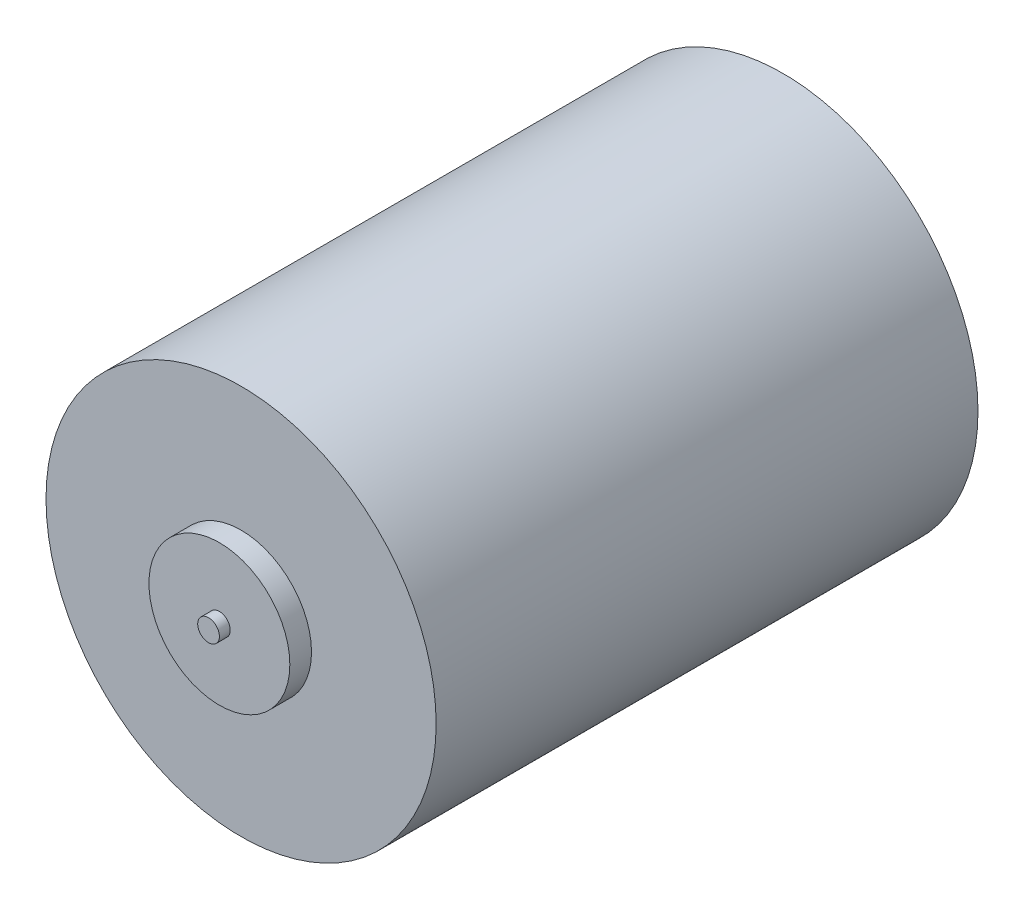
ISO-10303-21;
HEADER;
FILE_DESCRIPTION(('STEP AP214'),'2;1');
FILE_NAME('part.step','',(''),(''),'','','');
FILE_SCHEMA(('AUTOMOTIVE_DESIGN { 1 0 10303 214 1 1 1 1 }'));
ENDSEC;
DATA;
#1=APPLICATION_CONTEXT('core data for automotive mechanical design processes');
#2=APPLICATION_PROTOCOL_DEFINITION('international standard','automotive_design',2000,#1);
#3=PRODUCT_CONTEXT('',#1,'mechanical');
#4=PRODUCT('Part','Part','',(#3));
#5=PRODUCT_RELATED_PRODUCT_CATEGORY('part','',(#4));
#6=PRODUCT_DEFINITION_FORMATION('','',#4);
#7=PRODUCT_DEFINITION_CONTEXT('part definition',#1,'design');
#8=PRODUCT_DEFINITION('design','',#6,#7);
#9=PRODUCT_DEFINITION_SHAPE('','',#8);
#10=(LENGTH_UNIT() NAMED_UNIT(*) SI_UNIT(.MILLI.,.METRE.));
#11=(NAMED_UNIT(*) PLANE_ANGLE_UNIT() SI_UNIT($,.RADIAN.));
#12=(NAMED_UNIT(*) SI_UNIT($,.STERADIAN.) SOLID_ANGLE_UNIT());
#13=UNCERTAINTY_MEASURE_WITH_UNIT(LENGTH_MEASURE(1.E-05),#10,'distance_accuracy_value','');
#14=(GEOMETRIC_REPRESENTATION_CONTEXT(3) GLOBAL_UNCERTAINTY_ASSIGNED_CONTEXT((#13)) GLOBAL_UNIT_ASSIGNED_CONTEXT((#10,
#11,#12)) REPRESENTATION_CONTEXT('',''));
#15=CARTESIAN_POINT('',(0.,0.,0.));
#16=DIRECTION('',(0.,0.,1.));
#17=DIRECTION('',(1.,0.,0.));
#18=AXIS2_PLACEMENT_3D('',#15,#16,#17);
#19=CARTESIAN_POINT('',(0.,0.,50.));
#20=DIRECTION('',(0.,0.,-1.));
#21=DIRECTION('',(-1.,0.,0.));
#22=AXIS2_PLACEMENT_3D('',#19,#20,#21);
#23=CYLINDRICAL_SURFACE('',#22,18.);
#24=CARTESIAN_POINT('',(0.,0.,50.));
#25=DIRECTION('',(0.,0.,1.));
#26=DIRECTION('',(1.,0.,0.));
#27=AXIS2_PLACEMENT_3D('',#24,#25,#26);
#28=CIRCLE('',#27,18.);
#29=CARTESIAN_POINT('',(18.,0.,50.));
#30=VERTEX_POINT('',#29);
#31=EDGE_CURVE('E46',#30,#30,#28,.T.);
#32=ORIENTED_EDGE('',*,*,#31,.F.);
#33=EDGE_LOOP('',(#32));
#34=FACE_BOUND('',#33,.T.);
#35=CARTESIAN_POINT('',(0.,0.,0.));
#36=DIRECTION('',(0.,0.,1.));
#37=DIRECTION('',(1.,0.,0.));
#38=AXIS2_PLACEMENT_3D('',#35,#36,#37);
#39=CIRCLE('',#38,18.);
#40=CARTESIAN_POINT('',(18.,0.,0.));
#41=VERTEX_POINT('',#40);
#42=EDGE_CURVE('E37',#41,#41,#39,.T.);
#43=ORIENTED_EDGE('',*,*,#42,.T.);
#44=EDGE_LOOP('',(#43));
#45=FACE_BOUND('',#44,.T.);
#46=ADVANCED_FACE('F34',(#34,#45),#23,.T.);
#47=CARTESIAN_POINT('',(0.,0.,50.));
#48=DIRECTION('',(0.,0.,1.));
#49=DIRECTION('',(1.,0.,0.));
#50=AXIS2_PLACEMENT_3D('',#47,#48,#49);
#51=PLANE('',#50);
#52=CARTESIAN_POINT('',(0.,0.,50.));
#53=DIRECTION('',(0.,0.,1.));
#54=DIRECTION('',(1.,0.,0.));
#55=AXIS2_PLACEMENT_3D('',#52,#53,#54);
#56=CIRCLE('',#55,6.5);
#57=CARTESIAN_POINT('',(6.5,0.,50.));
#58=VERTEX_POINT('',#57);
#59=EDGE_CURVE('E41',#58,#58,#56,.T.);
#60=ORIENTED_EDGE('',*,*,#59,.F.);
#61=EDGE_LOOP('',(#60));
#62=FACE_BOUND('',#61,.T.);
#63=ORIENTED_EDGE('',*,*,#31,.T.);
#64=EDGE_LOOP('',(#63));
#65=FACE_BOUND('',#64,.T.);
#66=ADVANCED_FACE('F63',(#62,#65),#51,.T.);
#67=CARTESIAN_POINT('',(0.,0.,0.));
#68=DIRECTION('',(0.,0.,1.));
#69=DIRECTION('',(1.,0.,0.));
#70=AXIS2_PLACEMENT_3D('',#67,#68,#69);
#71=PLANE('',#70);
#72=ORIENTED_EDGE('',*,*,#42,.F.);
#73=EDGE_LOOP('',(#72));
#74=FACE_BOUND('',#73,.T.);
#75=ADVANCED_FACE('F60',(#74),#71,.F.);
#76=CARTESIAN_POINT('',(0.,0.,52.));
#77=DIRECTION('',(0.,0.,-1.));
#78=DIRECTION('',(-1.,0.,0.));
#79=AXIS2_PLACEMENT_3D('',#76,#77,#78);
#80=CYLINDRICAL_SURFACE('',#79,6.5);
#81=CARTESIAN_POINT('',(0.,0.,52.));
#82=DIRECTION('',(0.,0.,1.));
#83=DIRECTION('',(1.,0.,0.));
#84=AXIS2_PLACEMENT_3D('',#81,#82,#83);
#85=CIRCLE('',#84,6.5);
#86=CARTESIAN_POINT('',(6.5,0.,52.));
#87=VERTEX_POINT('',#86);
#88=EDGE_CURVE('E51',#87,#87,#85,.T.);
#89=ORIENTED_EDGE('',*,*,#88,.F.);
#90=EDGE_LOOP('',(#89));
#91=FACE_BOUND('',#90,.T.);
#92=ORIENTED_EDGE('',*,*,#59,.T.);
#93=EDGE_LOOP('',(#92));
#94=FACE_BOUND('',#93,.T.);
#95=ADVANCED_FACE('F62',(#91,#94),#80,.T.);
#96=CARTESIAN_POINT('',(0.,0.,52.));
#97=DIRECTION('',(0.,0.,1.));
#98=DIRECTION('',(1.,0.,0.));
#99=AXIS2_PLACEMENT_3D('',#96,#97,#98);
#100=PLANE('',#99);
#101=CARTESIAN_POINT('',(0.,0.,52.));
#102=DIRECTION('',(0.,0.,1.));
#103=DIRECTION('',(1.,0.,0.));
#104=AXIS2_PLACEMENT_3D('',#101,#102,#103);
#105=CIRCLE('',#104,1.);
#106=CARTESIAN_POINT('',(1.,0.,52.));
#107=VERTEX_POINT('',#106);
#108=EDGE_CURVE('E10',#107,#107,#105,.T.);
#109=ORIENTED_EDGE('',*,*,#108,.F.);
#110=EDGE_LOOP('',(#109));
#111=FACE_BOUND('',#110,.T.);
#112=ORIENTED_EDGE('',*,*,#88,.T.);
#113=EDGE_LOOP('',(#112));
#114=FACE_BOUND('',#113,.T.);
#115=ADVANCED_FACE('F68',(#111,#114),#100,.T.);
#116=CARTESIAN_POINT('',(0.,0.,53.));
#117=DIRECTION('',(0.,0.,-1.));
#118=DIRECTION('',(-1.,0.,0.));
#119=AXIS2_PLACEMENT_3D('',#116,#117,#118);
#120=CYLINDRICAL_SURFACE('',#119,1.);
#121=CARTESIAN_POINT('',(0.,0.,53.));
#122=DIRECTION('',(0.,0.,1.));
#123=DIRECTION('',(1.,0.,0.));
#124=AXIS2_PLACEMENT_3D('',#121,#122,#123);
#125=CIRCLE('',#124,1.);
#126=CARTESIAN_POINT('',(1.,0.,53.));
#127=VERTEX_POINT('',#126);
#128=EDGE_CURVE('E50',#127,#127,#125,.T.);
#129=ORIENTED_EDGE('',*,*,#128,.F.);
#130=EDGE_LOOP('',(#129));
#131=FACE_BOUND('',#130,.T.);
#132=ORIENTED_EDGE('',*,*,#108,.T.);
#133=EDGE_LOOP('',(#132));
#134=FACE_BOUND('',#133,.T.);
#135=ADVANCED_FACE('F98',(#131,#134),#120,.T.);
#136=CARTESIAN_POINT('',(0.,0.,53.));
#137=DIRECTION('',(0.,0.,1.));
#138=DIRECTION('',(1.,0.,0.));
#139=AXIS2_PLACEMENT_3D('',#136,#137,#138);
#140=PLANE('',#139);
#141=ORIENTED_EDGE('',*,*,#128,.T.);
#142=EDGE_LOOP('',(#141));
#143=FACE_BOUND('',#142,.T.);
#144=ADVANCED_FACE('F108',(#143),#140,.T.);
#145=CLOSED_SHELL('',(#46,#66,#75,#95,#115,#135,#144));
#146=MANIFOLD_SOLID_BREP('B2',#145);
#147=ADVANCED_BREP_SHAPE_REPRESENTATION('',(#18,#146),#14);
#148=SHAPE_DEFINITION_REPRESENTATION(#9,#147);
ENDSEC;
END-ISO-10303-21;
